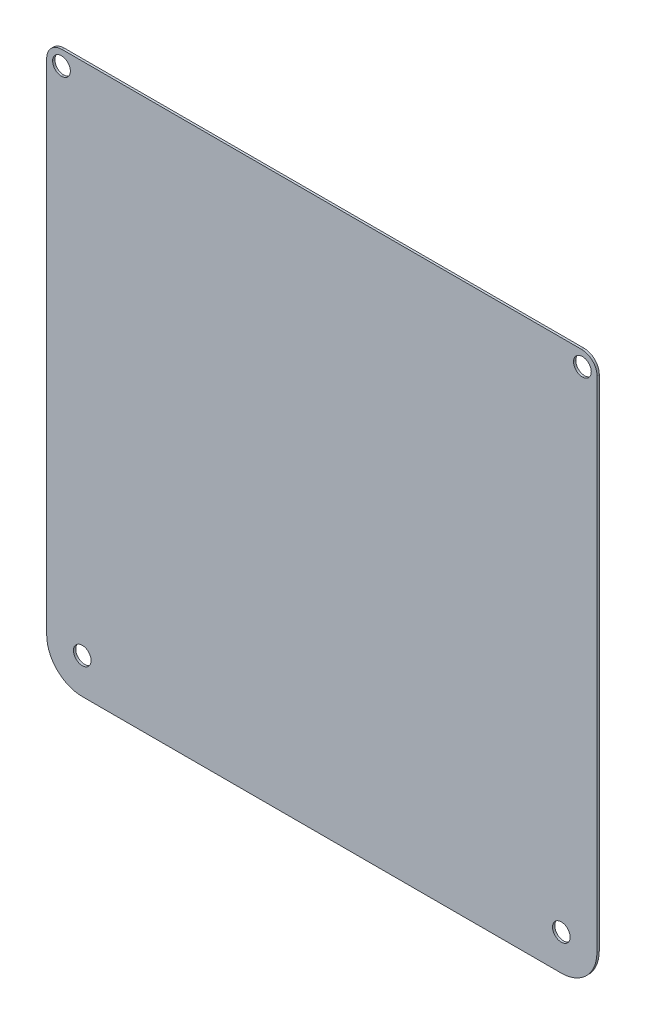
ISO-10303-21;
HEADER;
FILE_DESCRIPTION(('STEP AP214'),'2;1');
FILE_NAME('part.step','',(''),(''),'','','');
FILE_SCHEMA(('AUTOMOTIVE_DESIGN { 1 0 10303 214 1 1 1 1 }'));
ENDSEC;
DATA;
#1=APPLICATION_CONTEXT('core data for automotive mechanical design processes');
#2=APPLICATION_PROTOCOL_DEFINITION('international standard','automotive_design',2000,#1);
#3=PRODUCT_CONTEXT('',#1,'mechanical');
#4=PRODUCT('Part','Part','',(#3));
#5=PRODUCT_RELATED_PRODUCT_CATEGORY('part','',(#4));
#6=PRODUCT_DEFINITION_FORMATION('','',#4);
#7=PRODUCT_DEFINITION_CONTEXT('part definition',#1,'design');
#8=PRODUCT_DEFINITION('design','',#6,#7);
#9=PRODUCT_DEFINITION_SHAPE('','',#8);
#10=(LENGTH_UNIT() NAMED_UNIT(*) SI_UNIT(.MILLI.,.METRE.));
#11=(NAMED_UNIT(*) PLANE_ANGLE_UNIT() SI_UNIT($,.RADIAN.));
#12=(NAMED_UNIT(*) SI_UNIT($,.STERADIAN.) SOLID_ANGLE_UNIT());
#13=UNCERTAINTY_MEASURE_WITH_UNIT(LENGTH_MEASURE(1.E-05),#10,'distance_accuracy_value','');
#14=(GEOMETRIC_REPRESENTATION_CONTEXT(3) GLOBAL_UNCERTAINTY_ASSIGNED_CONTEXT((#13)) GLOBAL_UNIT_ASSIGNED_CONTEXT((#10,
#11,#12)) REPRESENTATION_CONTEXT('',''));
#15=CARTESIAN_POINT('',(0.,0.,0.));
#16=DIRECTION('',(0.,0.,1.));
#17=DIRECTION('',(1.,0.,0.));
#18=AXIS2_PLACEMENT_3D('',#15,#16,#17);
#19=CARTESIAN_POINT('',(2.70000508001,97.300195580391,0.));
#20=DIRECTION('',(0.,0.,-1.));
#21=DIRECTION('',(0.999941453103216,0.0108208301820623,0.));
#22=AXIS2_PLACEMENT_3D('',#19,#20,#21);
#23=CYLINDRICAL_SURFACE('',#22,1.612702565405);
#24=DIRECTION('',(0.,0.,1.));
#25=VECTOR('',#24,1.);
#26=CARTESIAN_POINT('',(4.312613226685,97.317646360986,0.));
#27=LINE('',#26,#25);
#28=CARTESIAN_POINT('',(4.312613226685,97.317646360986,0.));
#29=VERTEX_POINT('',#28);
#30=CARTESIAN_POINT('',(4.312613226685,97.317646360986,0.411480822962));
#31=VERTEX_POINT('',#30);
#32=EDGE_CURVE('E26',#29,#31,#27,.T.);
#33=ORIENTED_EDGE('',*,*,#32,.T.);
#34=CARTESIAN_POINT('',(2.70000508001,97.300195580391,0.411480822962));
#35=DIRECTION('',(0.,0.,1.));
#36=DIRECTION('',(0.999941453103216,0.0108208301820623,0.));
#37=AXIS2_PLACEMENT_3D('',#34,#35,#36);
#38=CIRCLE('',#37,1.612702565405);
#39=CARTESIAN_POINT('',(2.70000508001,98.912898145796,0.411480822962));
#40=VERTEX_POINT('',#39);
#41=EDGE_CURVE('E268',#31,#40,#38,.T.);
#42=ORIENTED_EDGE('',*,*,#41,.T.);
#43=DIRECTION('',(0.,0.,1.));
#44=VECTOR('',#43,1.);
#45=CARTESIAN_POINT('',(2.70000508001,98.912898145796,0.));
#46=LINE('',#45,#44);
#47=CARTESIAN_POINT('',(2.70000508001,98.912898145796,0.));
#48=VERTEX_POINT('',#47);
#49=EDGE_CURVE('E11',#48,#40,#46,.T.);
#50=ORIENTED_EDGE('',*,*,#49,.F.);
#51=CARTESIAN_POINT('',(2.70000508001,97.300195580391,0.));
#52=DIRECTION('',(0.,0.,1.));
#53=DIRECTION('',(0.999941453103216,0.0108208301820623,0.));
#54=AXIS2_PLACEMENT_3D('',#51,#52,#53);
#55=CIRCLE('',#54,1.612702565405);
#56=EDGE_CURVE('E343',#29,#48,#55,.T.);
#57=ORIENTED_EDGE('',*,*,#56,.F.);
#58=EDGE_LOOP('',(#33,#42,#50,#57));
#59=FACE_BOUND('',#58,.T.);
#60=ADVANCED_FACE('F16',(#59),#23,.F.);
#61=CARTESIAN_POINT('',(2.70000508001,97.300195580391,0.));
#62=DIRECTION('',(0.,0.,-1.));
#63=DIRECTION('',(0.,1.,0.));
#64=AXIS2_PLACEMENT_3D('',#61,#62,#63);
#65=CYLINDRICAL_SURFACE('',#64,1.612702565405);
#66=ORIENTED_EDGE('',*,*,#49,.T.);
#67=CARTESIAN_POINT('',(2.70000508001,97.300195580391,0.411480822962));
#68=DIRECTION('',(0.,0.,1.));
#69=DIRECTION('',(0.,1.,0.));
#70=AXIS2_PLACEMENT_3D('',#67,#68,#69);
#71=CIRCLE('',#70,1.612702565405);
#72=CARTESIAN_POINT('',(1.087302514605,97.300195580391,0.411480822962));
#73=VERTEX_POINT('',#72);
#74=EDGE_CURVE('E367',#40,#73,#71,.T.);
#75=ORIENTED_EDGE('',*,*,#74,.T.);
#76=DIRECTION('',(0.,0.,1.));
#77=VECTOR('',#76,1.);
#78=CARTESIAN_POINT('',(1.087302514605,97.300195580391,0.));
#79=LINE('',#78,#77);
#80=CARTESIAN_POINT('',(1.087302514605,97.300195580391,0.));
#81=VERTEX_POINT('',#80);
#82=EDGE_CURVE('E292',#81,#73,#79,.T.);
#83=ORIENTED_EDGE('',*,*,#82,.F.);
#84=CARTESIAN_POINT('',(2.70000508001,97.300195580391,0.));
#85=DIRECTION('',(0.,0.,1.));
#86=DIRECTION('',(0.,1.,0.));
#87=AXIS2_PLACEMENT_3D('',#84,#85,#86);
#88=CIRCLE('',#87,1.612702565405);
#89=EDGE_CURVE('E347',#48,#81,#88,.T.);
#90=ORIENTED_EDGE('',*,*,#89,.F.);
#91=EDGE_LOOP('',(#66,#75,#83,#90));
#92=FACE_BOUND('',#91,.T.);
#93=ADVANCED_FACE('F601',(#92),#65,.F.);
#94=CARTESIAN_POINT('',(4.312707645415,97.300195580401,0.));
#95=DIRECTION('',(-0.99998536316867,-0.00541049428641121,0.));
#96=DIRECTION('',(-0.00541049428641121,0.99998536316867,0.));
#97=AXIS2_PLACEMENT_3D('',#94,#95,#96);
#98=PLANE('',#97);
#99=DIRECTION('',(0.,0.,1.));
#100=VECTOR('',#99,1.);
#101=CARTESIAN_POINT('',(4.312707645415,97.300195581343,0.));
#102=LINE('',#101,#100);
#103=CARTESIAN_POINT('',(4.312707645415,97.300195581343,0.));
#104=VERTEX_POINT('',#103);
#105=CARTESIAN_POINT('',(4.312707645415,97.300195581343,0.411480822962));
#106=VERTEX_POINT('',#105);
#107=EDGE_CURVE('E40',#104,#106,#102,.T.);
#108=ORIENTED_EDGE('',*,*,#107,.T.);
#109=DIRECTION('',(-0.00541049428641121,0.99998536316867,0.));
#110=VECTOR('',#109,1.);
#111=CARTESIAN_POINT('',(4.312707645415,97.300195580401,0.411480822962));
#112=LINE('',#111,#110);
#113=EDGE_CURVE('E264',#106,#31,#112,.T.);
#114=ORIENTED_EDGE('',*,*,#113,.T.);
#115=ORIENTED_EDGE('',*,*,#32,.F.);
#116=DIRECTION('',(-0.00541049428641121,0.99998536316867,0.));
#117=VECTOR('',#116,1.);
#118=CARTESIAN_POINT('',(4.312707645415,97.300195580401,0.));
#119=LINE('',#118,#117);
#120=EDGE_CURVE('E19',#104,#29,#119,.T.);
#121=ORIENTED_EDGE('',*,*,#120,.F.);
#122=EDGE_LOOP('',(#108,#114,#115,#121));
#123=FACE_BOUND('',#122,.T.);
#124=ADVANCED_FACE('F524',(#123),#98,.T.);
#125=CARTESIAN_POINT('',(2.70000508001,97.300195580391,0.));
#126=DIRECTION('',(0.,0.,-1.));
#127=DIRECTION('',(-1.,0.,0.));
#128=AXIS2_PLACEMENT_3D('',#125,#126,#127);
#129=CYLINDRICAL_SURFACE('',#128,1.612702565405);
#130=ORIENTED_EDGE('',*,*,#82,.T.);
#131=CARTESIAN_POINT('',(2.70000508001,97.300195580391,0.411480822962));
#132=DIRECTION('',(0.,0.,1.));
#133=DIRECTION('',(-1.,0.,0.));
#134=AXIS2_PLACEMENT_3D('',#131,#132,#133);
#135=CIRCLE('',#134,1.612702565405);
#136=CARTESIAN_POINT('',(2.70000508001,95.687493014986,0.411480822962));
#137=VERTEX_POINT('',#136);
#138=EDGE_CURVE('E374',#73,#137,#135,.T.);
#139=ORIENTED_EDGE('',*,*,#138,.T.);
#140=DIRECTION('',(0.,0.,1.));
#141=VECTOR('',#140,1.);
#142=CARTESIAN_POINT('',(2.70000508001,95.687493014986,0.));
#143=LINE('',#142,#141);
#144=CARTESIAN_POINT('',(2.70000508001,95.687493014986,0.));
#145=VERTEX_POINT('',#144);
#146=EDGE_CURVE('E269',#145,#137,#143,.T.);
#147=ORIENTED_EDGE('',*,*,#146,.F.);
#148=CARTESIAN_POINT('',(2.70000508001,97.300195580391,0.));
#149=DIRECTION('',(0.,0.,1.));
#150=DIRECTION('',(-1.,0.,0.));
#151=AXIS2_PLACEMENT_3D('',#148,#149,#150);
#152=CIRCLE('',#151,1.612702565405);
#153=EDGE_CURVE('E276',#81,#145,#152,.T.);
#154=ORIENTED_EDGE('',*,*,#153,.F.);
#155=EDGE_LOOP('',(#130,#139,#147,#154));
#156=FACE_BOUND('',#155,.T.);
#157=ADVANCED_FACE('F572',(#156),#129,.F.);
#158=CARTESIAN_POINT('',(2.70000508001,97.300195580391,0.));
#159=DIRECTION('',(0.,0.,-1.));
#160=DIRECTION('',(0.,-1.,0.));
#161=AXIS2_PLACEMENT_3D('',#158,#159,#160);
#162=CYLINDRICAL_SURFACE('',#161,1.612702565405);
#163=ORIENTED_EDGE('',*,*,#146,.T.);
#164=CARTESIAN_POINT('',(2.70000508001,97.300195580391,0.411480822962));
#165=DIRECTION('',(0.,0.,1.));
#166=DIRECTION('',(0.,-1.,0.));
#167=AXIS2_PLACEMENT_3D('',#164,#165,#166);
#168=CIRCLE('',#167,1.612702565405);
#169=EDGE_CURVE('E267',#137,#106,#168,.T.);
#170=ORIENTED_EDGE('',*,*,#169,.T.);
#171=ORIENTED_EDGE('',*,*,#107,.F.);
#172=CARTESIAN_POINT('',(2.70000508001,97.300195580391,0.));
#173=DIRECTION('',(0.,0.,1.));
#174=DIRECTION('',(0.,-1.,0.));
#175=AXIS2_PLACEMENT_3D('',#172,#173,#174);
#176=CIRCLE('',#175,1.612702565405);
#177=EDGE_CURVE('E428',#145,#104,#176,.T.);
#178=ORIENTED_EDGE('',*,*,#177,.F.);
#179=EDGE_LOOP('',(#163,#170,#171,#178));
#180=FACE_BOUND('',#179,.T.);
#181=ADVANCED_FACE('F521',(#180),#162,.F.);
#182=CARTESIAN_POINT('',(97.300195580391,97.300195580391,0.));
#183=DIRECTION('',(0.,0.,-1.));
#184=DIRECTION('',(0.999941453103216,0.0108208301820623,0.));
#185=AXIS2_PLACEMENT_3D('',#182,#183,#184);
#186=CYLINDRICAL_SURFACE('',#185,1.612702565405);
#187=DIRECTION('',(0.,0.,1.));
#188=VECTOR('',#187,1.);
#189=CARTESIAN_POINT('',(98.912803727066,97.317646360986,0.));
#190=LINE('',#189,#188);
#191=CARTESIAN_POINT('',(98.912803727066,97.317646360986,0.));
#192=VERTEX_POINT('',#191);
#193=CARTESIAN_POINT('',(98.912803727066,97.317646360986,0.411480822962));
#194=VERTEX_POINT('',#193);
#195=EDGE_CURVE('E219',#192,#194,#190,.T.);
#196=ORIENTED_EDGE('',*,*,#195,.T.);
#197=CARTESIAN_POINT('',(97.300195580391,97.300195580391,0.411480822962));
#198=DIRECTION('',(0.,0.,1.));
#199=DIRECTION('',(0.999941453103216,0.0108208301820623,0.));
#200=AXIS2_PLACEMENT_3D('',#197,#198,#199);
#201=CIRCLE('',#200,1.612702565405);
#202=CARTESIAN_POINT('',(97.300195580391,98.912898145796,0.411480822962));
#203=VERTEX_POINT('',#202);
#204=EDGE_CURVE('E223',#194,#203,#201,.T.);
#205=ORIENTED_EDGE('',*,*,#204,.T.);
#206=DIRECTION('',(0.,0.,1.));
#207=VECTOR('',#206,1.);
#208=CARTESIAN_POINT('',(97.300195580391,98.912898145796,0.));
#209=LINE('',#208,#207);
#210=CARTESIAN_POINT('',(97.300195580391,98.912898145796,0.));
#211=VERTEX_POINT('',#210);
#212=EDGE_CURVE('E212',#211,#203,#209,.T.);
#213=ORIENTED_EDGE('',*,*,#212,.F.);
#214=CARTESIAN_POINT('',(97.300195580391,97.300195580391,0.));
#215=DIRECTION('',(0.,0.,1.));
#216=DIRECTION('',(0.999941453103216,0.0108208301820623,0.));
#217=AXIS2_PLACEMENT_3D('',#214,#215,#216);
#218=CIRCLE('',#217,1.612702565405);
#219=EDGE_CURVE('E226',#192,#211,#218,.T.);
#220=ORIENTED_EDGE('',*,*,#219,.F.);
#221=EDGE_LOOP('',(#196,#205,#213,#220));
#222=FACE_BOUND('',#221,.T.);
#223=ADVANCED_FACE('F221',(#222),#186,.F.);
#224=CARTESIAN_POINT('',(97.300195580391,97.300195580391,0.));
#225=DIRECTION('',(0.,0.,-1.));
#226=DIRECTION('',(0.,1.,0.));
#227=AXIS2_PLACEMENT_3D('',#224,#225,#226);
#228=CYLINDRICAL_SURFACE('',#227,1.612702565405);
#229=ORIENTED_EDGE('',*,*,#212,.T.);
#230=CARTESIAN_POINT('',(97.300195580391,97.300195580391,0.411480822962));
#231=DIRECTION('',(0.,0.,1.));
#232=DIRECTION('',(0.,1.,0.));
#233=AXIS2_PLACEMENT_3D('',#230,#231,#232);
#234=CIRCLE('',#233,1.612702565405);
#235=CARTESIAN_POINT('',(95.687493014986,97.300195580391,0.411480822962));
#236=VERTEX_POINT('',#235);
#237=EDGE_CURVE('E246',#203,#236,#234,.T.);
#238=ORIENTED_EDGE('',*,*,#237,.T.);
#239=DIRECTION('',(0.,0.,1.));
#240=VECTOR('',#239,1.);
#241=CARTESIAN_POINT('',(95.687493014986,97.300195580391,0.));
#242=LINE('',#241,#240);
#243=CARTESIAN_POINT('',(95.687493014986,97.300195580391,0.));
#244=VERTEX_POINT('',#243);
#245=EDGE_CURVE('E231',#244,#236,#242,.T.);
#246=ORIENTED_EDGE('',*,*,#245,.F.);
#247=CARTESIAN_POINT('',(97.300195580391,97.300195580391,0.));
#248=DIRECTION('',(0.,0.,1.));
#249=DIRECTION('',(0.,1.,0.));
#250=AXIS2_PLACEMENT_3D('',#247,#248,#249);
#251=CIRCLE('',#250,1.612702565405);
#252=EDGE_CURVE('E429',#211,#244,#251,.T.);
#253=ORIENTED_EDGE('',*,*,#252,.F.);
#254=EDGE_LOOP('',(#229,#238,#246,#253));
#255=FACE_BOUND('',#254,.T.);
#256=ADVANCED_FACE('F591',(#255),#228,.F.);
#257=CARTESIAN_POINT('',(98.912898145796,97.300195580401,0.));
#258=DIRECTION('',(-0.99998536316867,-0.00541049428641121,0.));
#259=DIRECTION('',(-0.00541049428641121,0.99998536316867,0.));
#260=AXIS2_PLACEMENT_3D('',#257,#258,#259);
#261=PLANE('',#260);
#262=DIRECTION('',(0.,0.,1.));
#263=VECTOR('',#262,1.);
#264=CARTESIAN_POINT('',(98.912898145796,97.300195581343,0.));
#265=LINE('',#264,#263);
#266=CARTESIAN_POINT('',(98.912898145796,97.300195581343,0.));
#267=VERTEX_POINT('',#266);
#268=CARTESIAN_POINT('',(98.912898145796,97.300195581343,0.411480822962));
#269=VERTEX_POINT('',#268);
#270=EDGE_CURVE('E236',#267,#269,#265,.T.);
#271=ORIENTED_EDGE('',*,*,#270,.T.);
#272=DIRECTION('',(-0.00541049428641121,0.99998536316867,0.));
#273=VECTOR('',#272,1.);
#274=CARTESIAN_POINT('',(98.912898145796,97.300195580401,0.411480822962));
#275=LINE('',#274,#273);
#276=EDGE_CURVE('E234',#269,#194,#275,.T.);
#277=ORIENTED_EDGE('',*,*,#276,.T.);
#278=ORIENTED_EDGE('',*,*,#195,.F.);
#279=DIRECTION('',(-0.00541049428641121,0.99998536316867,0.));
#280=VECTOR('',#279,1.);
#281=CARTESIAN_POINT('',(98.912898145796,97.300195580401,0.));
#282=LINE('',#281,#280);
#283=EDGE_CURVE('E307',#267,#192,#282,.T.);
#284=ORIENTED_EDGE('',*,*,#283,.F.);
#285=EDGE_LOOP('',(#271,#277,#278,#284));
#286=FACE_BOUND('',#285,.T.);
#287=ADVANCED_FACE('F235',(#286),#261,.T.);
#288=CARTESIAN_POINT('',(97.300195580391,97.300195580391,0.));
#289=DIRECTION('',(0.,0.,-1.));
#290=DIRECTION('',(-1.,0.,0.));
#291=AXIS2_PLACEMENT_3D('',#288,#289,#290);
#292=CYLINDRICAL_SURFACE('',#291,1.612702565405);
#293=ORIENTED_EDGE('',*,*,#245,.T.);
#294=CARTESIAN_POINT('',(97.300195580391,97.300195580391,0.411480822962));
#295=DIRECTION('',(0.,0.,1.));
#296=DIRECTION('',(-1.,0.,0.));
#297=AXIS2_PLACEMENT_3D('',#294,#295,#296);
#298=CIRCLE('',#297,1.612702565405);
#299=CARTESIAN_POINT('',(97.300195580391,95.687493014986,0.411480822962));
#300=VERTEX_POINT('',#299);
#301=EDGE_CURVE('E253',#236,#300,#298,.T.);
#302=ORIENTED_EDGE('',*,*,#301,.T.);
#303=DIRECTION('',(0.,0.,1.));
#304=VECTOR('',#303,1.);
#305=CARTESIAN_POINT('',(97.300195580391,95.687493014986,0.));
#306=LINE('',#305,#304);
#307=CARTESIAN_POINT('',(97.300195580391,95.687493014986,0.));
#308=VERTEX_POINT('',#307);
#309=EDGE_CURVE('E370',#308,#300,#306,.T.);
#310=ORIENTED_EDGE('',*,*,#309,.F.);
#311=CARTESIAN_POINT('',(97.300195580391,97.300195580391,0.));
#312=DIRECTION('',(0.,0.,1.));
#313=DIRECTION('',(-1.,0.,0.));
#314=AXIS2_PLACEMENT_3D('',#311,#312,#313);
#315=CIRCLE('',#314,1.612702565405);
#316=EDGE_CURVE('E424',#244,#308,#315,.T.);
#317=ORIENTED_EDGE('',*,*,#316,.F.);
#318=EDGE_LOOP('',(#293,#302,#310,#317));
#319=FACE_BOUND('',#318,.T.);
#320=ADVANCED_FACE('F544',(#319),#292,.F.);
#321=CARTESIAN_POINT('',(97.300195580391,97.300195580391,0.));
#322=DIRECTION('',(0.,0.,-1.));
#323=DIRECTION('',(0.,-1.,0.));
#324=AXIS2_PLACEMENT_3D('',#321,#322,#323);
#325=CYLINDRICAL_SURFACE('',#324,1.612702565405);
#326=ORIENTED_EDGE('',*,*,#309,.T.);
#327=CARTESIAN_POINT('',(97.300195580391,97.300195580391,0.411480822962));
#328=DIRECTION('',(0.,0.,1.));
#329=DIRECTION('',(0.,-1.,0.));
#330=AXIS2_PLACEMENT_3D('',#327,#328,#329);
#331=CIRCLE('',#330,1.612702565405);
#332=EDGE_CURVE('E241',#300,#269,#331,.T.);
#333=ORIENTED_EDGE('',*,*,#332,.T.);
#334=ORIENTED_EDGE('',*,*,#270,.F.);
#335=CARTESIAN_POINT('',(97.300195580391,97.300195580391,0.));
#336=DIRECTION('',(0.,0.,1.));
#337=DIRECTION('',(0.,-1.,0.));
#338=AXIS2_PLACEMENT_3D('',#335,#336,#337);
#339=CIRCLE('',#338,1.612702565405);
#340=EDGE_CURVE('E289',#308,#267,#339,.T.);
#341=ORIENTED_EDGE('',*,*,#340,.F.);
#342=EDGE_LOOP('',(#326,#333,#334,#341));
#343=FACE_BOUND('',#342,.T.);
#344=ADVANCED_FACE('F460',(#343),#325,.F.);
#345=CARTESIAN_POINT('',(6.477012954026,6.477012954026,0.));
#346=DIRECTION('',(0.,0.,1.));
#347=DIRECTION('',(1.,0.,0.));
#348=AXIS2_PLACEMENT_3D('',#345,#346,#347);
#349=CYLINDRICAL_SURFACE('',#348,1.600003810008);
#350=DIRECTION('',(0.,0.,1.));
#351=VECTOR('',#350,1.);
#352=CARTESIAN_POINT('',(8.077016764034,6.477012954026,0.));
#353=LINE('',#352,#351);
#354=CARTESIAN_POINT('',(8.077016764034,6.477012954026,0.));
#355=VERTEX_POINT('',#354);
#356=CARTESIAN_POINT('',(8.077016764034,6.477012954026,0.411480822962));
#357=VERTEX_POINT('',#356);
#358=EDGE_CURVE('E152',#355,#357,#353,.T.);
#359=ORIENTED_EDGE('',*,*,#358,.F.);
#360=CARTESIAN_POINT('',(6.477012954026,6.477012954026,0.));
#361=DIRECTION('',(0.,0.,1.));
#362=DIRECTION('',(1.,0.,0.));
#363=AXIS2_PLACEMENT_3D('',#360,#361,#362);
#364=CIRCLE('',#363,1.600003810008);
#365=EDGE_CURVE('E262',#355,#355,#364,.T.);
#366=ORIENTED_EDGE('',*,*,#365,.F.);
#367=ORIENTED_EDGE('',*,*,#358,.T.);
#368=CARTESIAN_POINT('',(6.477012954026,6.477012954026,0.411480822962));
#369=DIRECTION('',(0.,0.,1.));
#370=DIRECTION('',(1.,0.,0.));
#371=AXIS2_PLACEMENT_3D('',#368,#369,#370);
#372=CIRCLE('',#371,1.600003810008);
#373=EDGE_CURVE('E323',#357,#357,#372,.T.);
#374=ORIENTED_EDGE('',*,*,#373,.T.);
#375=EDGE_LOOP('',(#359,#366,#367,#374));
#376=FACE_BOUND('',#375,.T.);
#377=ADVANCED_FACE('F552',(#376),#349,.F.);
#378=CARTESIAN_POINT('',(93.472186944374,6.477012954026,0.));
#379=DIRECTION('',(0.,0.,1.));
#380=DIRECTION('',(1.,0.,0.));
#381=AXIS2_PLACEMENT_3D('',#378,#379,#380);
#382=CYLINDRICAL_SURFACE('',#381,1.600003810008);
#383=DIRECTION('',(0.,0.,1.));
#384=VECTOR('',#383,1.);
#385=CARTESIAN_POINT('',(95.072190754382,6.477012954026,0.));
#386=LINE('',#385,#384);
#387=CARTESIAN_POINT('',(95.072190754382,6.477012954026,0.));
#388=VERTEX_POINT('',#387);
#389=CARTESIAN_POINT('',(95.072190754382,6.477012954026,0.411480822962));
#390=VERTEX_POINT('',#389);
#391=EDGE_CURVE('E164',#388,#390,#386,.T.);
#392=ORIENTED_EDGE('',*,*,#391,.F.);
#393=CARTESIAN_POINT('',(93.472186944374,6.477012954026,0.));
#394=DIRECTION('',(0.,0.,1.));
#395=DIRECTION('',(1.,0.,0.));
#396=AXIS2_PLACEMENT_3D('',#393,#394,#395);
#397=CIRCLE('',#396,1.600003810008);
#398=EDGE_CURVE('E259',#388,#388,#397,.T.);
#399=ORIENTED_EDGE('',*,*,#398,.F.);
#400=ORIENTED_EDGE('',*,*,#391,.T.);
#401=CARTESIAN_POINT('',(93.472186944374,6.477012954026,0.411480822962));
#402=DIRECTION('',(0.,0.,1.));
#403=DIRECTION('',(1.,0.,0.));
#404=AXIS2_PLACEMENT_3D('',#401,#402,#403);
#405=CIRCLE('',#404,1.600003810008);
#406=EDGE_CURVE('E312',#390,#390,#405,.T.);
#407=ORIENTED_EDGE('',*,*,#406,.T.);
#408=EDGE_LOOP('',(#392,#399,#400,#407));
#409=FACE_BOUND('',#408,.T.);
#410=ADVANCED_FACE('F557',(#409),#382,.F.);
#411=CARTESIAN_POINT('',(99.961899900713,97.180952719278,0.));
#412=DIRECTION('',(1.,2.824996688762E-08,0.));
#413=DIRECTION('',(0.,0.,-1.));
#414=AXIS2_PLACEMENT_3D('',#411,#412,#413);
#415=PLANE('',#414);
#416=DIRECTION('',(0.,0.,1.));
#417=VECTOR('',#416,1.);
#418=CARTESIAN_POINT('',(99.961899900713,97.180952719278,0.));
#419=LINE('',#418,#417);
#420=CARTESIAN_POINT('',(99.961899900713,97.180952719278,0.));
#421=VERTEX_POINT('',#420);
#422=CARTESIAN_POINT('',(99.961899900713,97.180952719278,0.411480822962));
#423=VERTEX_POINT('',#422);
#424=EDGE_CURVE('E327',#421,#423,#419,.T.);
#425=ORIENTED_EDGE('',*,*,#424,.T.);
#426=DIRECTION('',(2.824996688762E-08,-1.,0.));
#427=VECTOR('',#426,1.);
#428=CARTESIAN_POINT('',(99.961899900713,97.180952719278,0.411480822962));
#429=LINE('',#428,#427);
#430=CARTESIAN_POINT('',(99.961902462738,6.489712979426,0.411480822962));
#431=VERTEX_POINT('',#430);
#432=EDGE_CURVE('E333',#423,#431,#429,.T.);
#433=ORIENTED_EDGE('',*,*,#432,.T.);
#434=DIRECTION('',(0.,0.,1.));
#435=VECTOR('',#434,1.);
#436=CARTESIAN_POINT('',(99.961902462738,6.489712979426,0.));
#437=LINE('',#436,#435);
#438=CARTESIAN_POINT('',(99.961902462738,6.489712979426,0.));
#439=VERTEX_POINT('',#438);
#440=EDGE_CURVE('E324',#439,#431,#437,.T.);
#441=ORIENTED_EDGE('',*,*,#440,.F.);
#442=DIRECTION('',(2.824996688762E-08,-1.,0.));
#443=VECTOR('',#442,1.);
#444=CARTESIAN_POINT('',(99.961899900713,97.180952719278,0.));
#445=LINE('',#444,#443);
#446=EDGE_CURVE('E338',#421,#439,#445,.T.);
#447=ORIENTED_EDGE('',*,*,#446,.F.);
#448=EDGE_LOOP('',(#425,#433,#441,#447));
#449=FACE_BOUND('',#448,.T.);
#450=ADVANCED_FACE('F536',(#449),#415,.T.);
#451=CARTESIAN_POINT('',(99.961902462738,6.489712979426,0.));
#452=DIRECTION('',(0.,-1.,0.));
#453=DIRECTION('',(0.,0.,-1.));
#454=AXIS2_PLACEMENT_3D('',#451,#452,#453);
#455=PLANE('',#454);
#456=ORIENTED_EDGE('',*,*,#440,.T.);
#457=DIRECTION('',(-1.,0.,0.));
#458=VECTOR('',#457,1.);
#459=CARTESIAN_POINT('',(99.961902462738,6.489712979426,0.411480822962));
#460=LINE('',#459,#458);
#461=CARTESIAN_POINT('',(99.9491998984,6.489712979426,0.411480822962));
#462=VERTEX_POINT('',#461);
#463=EDGE_CURVE('E332',#431,#462,#460,.T.);
#464=ORIENTED_EDGE('',*,*,#463,.T.);
#465=DIRECTION('',(0.,0.,1.));
#466=VECTOR('',#465,1.);
#467=CARTESIAN_POINT('',(99.9491998984,6.489712979426,0.));
#468=LINE('',#467,#466);
#469=CARTESIAN_POINT('',(99.9491998984,6.489712979426,0.));
#470=VERTEX_POINT('',#469);
#471=EDGE_CURVE('E355',#470,#462,#468,.T.);
#472=ORIENTED_EDGE('',*,*,#471,.F.);
#473=DIRECTION('',(-1.,0.,0.));
#474=VECTOR('',#473,1.);
#475=CARTESIAN_POINT('',(99.961902462738,6.489712979426,0.));
#476=LINE('',#475,#474);
#477=EDGE_CURVE('E303',#439,#470,#476,.T.);
#478=ORIENTED_EDGE('',*,*,#477,.F.);
#479=EDGE_LOOP('',(#456,#464,#472,#478));
#480=FACE_BOUND('',#479,.T.);
#481=ADVANCED_FACE('F530',(#480),#455,.T.);
#482=CARTESIAN_POINT('',(97.180594361189,97.180594361189,0.));
#483=DIRECTION('',(0.,0.,-1.));
#484=DIRECTION('',(3.686394892713E-10,1.,0.));
#485=AXIS2_PLACEMENT_3D('',#482,#483,#484);
#486=CYLINDRICAL_SURFACE('',#485,2.781305562611);
#487=DIRECTION('',(0.,0.,1.));
#488=VECTOR('',#487,1.);
#489=CARTESIAN_POINT('',(97.180594362214,99.9618999238,0.));
#490=LINE('',#489,#488);
#491=CARTESIAN_POINT('',(97.180594362214,99.9618999238,0.));
#492=VERTEX_POINT('',#491);
#493=CARTESIAN_POINT('',(97.180594362214,99.9618999238,0.411480822962));
#494=VERTEX_POINT('',#493);
#495=EDGE_CURVE('E296',#492,#494,#490,.T.);
#496=ORIENTED_EDGE('',*,*,#495,.T.);
#497=CARTESIAN_POINT('',(97.180594361189,97.180594361189,0.411480822962));
#498=DIRECTION('',(0.,0.,-1.));
#499=DIRECTION('',(3.686394892713E-10,1.,0.));
#500=AXIS2_PLACEMENT_3D('',#497,#498,#499);
#501=CIRCLE('',#500,2.781305562611);
#502=EDGE_CURVE('E337',#494,#423,#501,.T.);
#503=ORIENTED_EDGE('',*,*,#502,.T.);
#504=ORIENTED_EDGE('',*,*,#424,.F.);
#505=CARTESIAN_POINT('',(97.180594361189,97.180594361189,0.));
#506=DIRECTION('',(0.,0.,-1.));
#507=DIRECTION('',(3.686394892713E-10,1.,0.));
#508=AXIS2_PLACEMENT_3D('',#505,#506,#507);
#509=CIRCLE('',#508,2.781305562611);
#510=EDGE_CURVE('E342',#492,#421,#509,.T.);
#511=ORIENTED_EDGE('',*,*,#510,.F.);
#512=EDGE_LOOP('',(#496,#503,#504,#511));
#513=FACE_BOUND('',#512,.T.);
#514=ADVANCED_FACE('F535',(#513),#486,.T.);
#515=CARTESIAN_POINT('',(99.949199900278,6.477012954026,0.));
#516=DIRECTION('',(0.,0.,-1.));
#517=DIRECTION('',(-1.47905619683098E-07,0.999999999999989,0.));
#518=AXIS2_PLACEMENT_3D('',#515,#516,#517);
#519=CYLINDRICAL_SURFACE('',#518,0.01270002540005);
#520=ORIENTED_EDGE('',*,*,#471,.T.);
#521=CARTESIAN_POINT('',(99.949199900278,6.477012954026,0.411480822962));
#522=DIRECTION('',(0.,0.,1.));
#523=DIRECTION('',(-1.47905619683098E-07,0.999999999999989,0.));
#524=AXIS2_PLACEMENT_3D('',#521,#522,#523);
#525=CIRCLE('',#524,0.01270002540005);
#526=CARTESIAN_POINT('',(99.936499874878,6.477012954026,0.411480822962));
#527=VERTEX_POINT('',#526);
#528=EDGE_CURVE('E328',#462,#527,#525,.T.);
#529=ORIENTED_EDGE('',*,*,#528,.T.);
#530=DIRECTION('',(0.,0.,1.));
#531=VECTOR('',#530,1.);
#532=CARTESIAN_POINT('',(99.936499874878,6.477012954026,0.));
#533=LINE('',#532,#531);
#534=CARTESIAN_POINT('',(99.936499874878,6.477012954026,0.));
#535=VERTEX_POINT('',#534);
#536=EDGE_CURVE('E293',#535,#527,#533,.T.);
#537=ORIENTED_EDGE('',*,*,#536,.F.);
#538=CARTESIAN_POINT('',(99.949199900278,6.477012954026,0.));
#539=DIRECTION('',(0.,0.,1.));
#540=DIRECTION('',(-1.47905619683098E-07,0.999999999999989,0.));
#541=AXIS2_PLACEMENT_3D('',#538,#539,#540);
#542=CIRCLE('',#541,0.01270002540005);
#543=EDGE_CURVE('E298',#470,#535,#542,.T.);
#544=ORIENTED_EDGE('',*,*,#543,.F.);
#545=EDGE_LOOP('',(#520,#529,#537,#544));
#546=FACE_BOUND('',#545,.T.);
#547=ADVANCED_FACE('F610',(#546),#519,.F.);
#548=CARTESIAN_POINT('',(2.793566712444,99.961899889174,0.));
#549=DIRECTION('',(-3.668527449115E-10,1.,0.));
#550=DIRECTION('',(0.,0.,1.));
#551=AXIS2_PLACEMENT_3D('',#548,#549,#550);
#552=PLANE('',#551);
#553=DIRECTION('',(0.,0.,1.));
#554=VECTOR('',#553,1.);
#555=CARTESIAN_POINT('',(2.793566712444,99.961899889174,0.));
#556=LINE('',#555,#554);
#557=CARTESIAN_POINT('',(2.793566712444,99.961899889174,0.));
#558=VERTEX_POINT('',#557);
#559=CARTESIAN_POINT('',(2.793566712444,99.961899889174,0.411480822962));
#560=VERTEX_POINT('',#559);
#561=EDGE_CURVE('E297',#558,#560,#556,.T.);
#562=ORIENTED_EDGE('',*,*,#561,.T.);
#563=DIRECTION('',(1.,3.668527449115E-10,0.));
#564=VECTOR('',#563,1.);
#565=CARTESIAN_POINT('',(2.793566712444,99.961899889174,0.411480822962));
#566=LINE('',#565,#564);
#567=EDGE_CURVE('E313',#560,#494,#566,.T.);
#568=ORIENTED_EDGE('',*,*,#567,.T.);
#569=ORIENTED_EDGE('',*,*,#495,.F.);
#570=DIRECTION('',(1.,3.668527449115E-10,0.));
#571=VECTOR('',#570,1.);
#572=CARTESIAN_POINT('',(2.793566712444,99.961899889174,0.));
#573=LINE('',#572,#571);
#574=EDGE_CURVE('E378',#558,#492,#573,.T.);
#575=ORIENTED_EDGE('',*,*,#574,.F.);
#576=EDGE_LOOP('',(#562,#568,#569,#575));
#577=FACE_BOUND('',#576,.T.);
#578=ADVANCED_FACE('F584',(#577),#552,.T.);
#579=CARTESIAN_POINT('',(93.472186946252,6.477012954026,0.));
#580=DIRECTION('',(0.,0.,-1.));
#581=DIRECTION('',(1.,0.,0.));
#582=AXIS2_PLACEMENT_3D('',#579,#580,#581);
#583=CYLINDRICAL_SURFACE('',#582,6.464312928626);
#584=ORIENTED_EDGE('',*,*,#536,.T.);
#585=CARTESIAN_POINT('',(93.472186946252,6.477012954026,0.411480822962));
#586=DIRECTION('',(0.,0.,-1.));
#587=DIRECTION('',(1.,0.,0.));
#588=AXIS2_PLACEMENT_3D('',#585,#586,#587);
#589=CIRCLE('',#588,6.464312928626);
#590=CARTESIAN_POINT('',(93.472186944374,0.01270002540005,0.411480822962));
#591=VERTEX_POINT('',#590);
#592=EDGE_CURVE('E275',#527,#591,#589,.T.);
#593=ORIENTED_EDGE('',*,*,#592,.T.);
#594=DIRECTION('',(0.,0.,1.));
#595=VECTOR('',#594,1.);
#596=CARTESIAN_POINT('',(93.472186944374,0.01270002540005,0.));
#597=LINE('',#596,#595);
#598=CARTESIAN_POINT('',(93.472186944374,0.01270002540005,0.));
#599=VERTEX_POINT('',#598);
#600=EDGE_CURVE('E279',#599,#591,#597,.T.);
#601=ORIENTED_EDGE('',*,*,#600,.F.);
#602=CARTESIAN_POINT('',(93.472186946252,6.477012954026,0.));
#603=DIRECTION('',(0.,0.,-1.));
#604=DIRECTION('',(1.,0.,0.));
#605=AXIS2_PLACEMENT_3D('',#602,#603,#604);
#606=CIRCLE('',#605,6.464312928626);
#607=EDGE_CURVE('E302',#535,#599,#606,.T.);
#608=ORIENTED_EDGE('',*,*,#607,.F.);
#609=EDGE_LOOP('',(#584,#593,#601,#608));
#610=FACE_BOUND('',#609,.T.);
#611=ADVANCED_FACE('F578',(#610),#583,.T.);
#612=CARTESIAN_POINT('',(2.794182662684,97.180412234475,0.));
#613=DIRECTION('',(0.,0.,-1.));
#614=DIRECTION('',(-0.999999997974242,-6.36515238026454E-05,0.));
#615=AXIS2_PLACEMENT_3D('',#612,#613,#614);
#616=CYLINDRICAL_SURFACE('',#615,2.781487722899);
#617=DIRECTION('',(0.,0.,1.));
#618=VECTOR('',#617,1.);
#619=CARTESIAN_POINT('',(0.01269494542007,97.180235188543,0.));
#620=LINE('',#619,#618);
#621=CARTESIAN_POINT('',(0.01269494542007,97.180235188543,0.));
#622=VERTEX_POINT('',#621);
#623=CARTESIAN_POINT('',(0.01269494542007,97.180235188543,0.411480822962));
#624=VERTEX_POINT('',#623);
#625=EDGE_CURVE('E399',#622,#624,#620,.T.);
#626=ORIENTED_EDGE('',*,*,#625,.T.);
#627=CARTESIAN_POINT('',(2.794182662684,97.180412234475,0.411480822962));
#628=DIRECTION('',(0.,0.,-1.));
#629=DIRECTION('',(-0.999999997974242,-6.36515238026454E-05,0.));
#630=AXIS2_PLACEMENT_3D('',#627,#628,#629);
#631=CIRCLE('',#630,2.781487722899);
#632=EDGE_CURVE('E308',#624,#560,#631,.T.);
#633=ORIENTED_EDGE('',*,*,#632,.T.);
#634=ORIENTED_EDGE('',*,*,#561,.F.);
#635=CARTESIAN_POINT('',(2.794182662684,97.180412234475,0.));
#636=DIRECTION('',(0.,0.,-1.));
#637=DIRECTION('',(-0.999999997974242,-6.36515238026454E-05,0.));
#638=AXIS2_PLACEMENT_3D('',#635,#636,#637);
#639=CIRCLE('',#638,2.781487722899);
#640=EDGE_CURVE('E394',#622,#558,#639,.T.);
#641=ORIENTED_EDGE('',*,*,#640,.F.);
#642=EDGE_LOOP('',(#626,#633,#634,#641));
#643=FACE_BOUND('',#642,.T.);
#644=ADVANCED_FACE('F583',(#643),#616,.T.);
#645=CARTESIAN_POINT('',(93.472186944374,0.01270002540005,0.));
#646=DIRECTION('',(8.75912408839897E-08,-1.,0.));
#647=DIRECTION('',(0.,0.,-1.));
#648=AXIS2_PLACEMENT_3D('',#645,#646,#647);
#649=PLANE('',#648);
#650=ORIENTED_EDGE('',*,*,#600,.T.);
#651=DIRECTION('',(-1.,-8.75912408839897E-08,0.));
#652=VECTOR('',#651,1.);
#653=CARTESIAN_POINT('',(93.472186944374,0.01270002540005,0.411480822962));
#654=LINE('',#653,#652);
#655=CARTESIAN_POINT('',(6.477452827375,0.01269240542334,0.411480822962));
#656=VERTEX_POINT('',#655);
#657=EDGE_CURVE('E272',#591,#656,#654,.T.);
#658=ORIENTED_EDGE('',*,*,#657,.T.);
#659=DIRECTION('',(0.,0.,1.));
#660=VECTOR('',#659,1.);
#661=CARTESIAN_POINT('',(6.477452827375,0.01269240542334,0.));
#662=LINE('',#661,#660);
#663=CARTESIAN_POINT('',(6.477452827375,0.01269240542334,0.));
#664=VERTEX_POINT('',#663);
#665=EDGE_CURVE('E318',#664,#656,#662,.T.);
#666=ORIENTED_EDGE('',*,*,#665,.F.);
#667=DIRECTION('',(-1.,-8.75912408839897E-08,0.));
#668=VECTOR('',#667,1.);
#669=CARTESIAN_POINT('',(93.472186944374,0.01270002540005,0.));
#670=LINE('',#669,#668);
#671=EDGE_CURVE('E263',#599,#664,#670,.T.);
#672=ORIENTED_EDGE('',*,*,#671,.F.);
#673=EDGE_LOOP('',(#650,#658,#666,#672));
#674=FACE_BOUND('',#673,.T.);
#675=ADVANCED_FACE('F638',(#674),#649,.T.);
#676=CARTESIAN_POINT('',(49.986351388675,50.423826775132,0.411480822962));
#677=DIRECTION('',(0.,0.,-1.));
#678=DIRECTION('',(0.,-1.,0.));
#679=AXIS2_PLACEMENT_3D('',#676,#677,#678);
#680=PLANE('',#679);
#681=ORIENTED_EDGE('',*,*,#138,.F.);
#682=ORIENTED_EDGE('',*,*,#74,.F.);
#683=ORIENTED_EDGE('',*,*,#41,.F.);
#684=ORIENTED_EDGE('',*,*,#113,.F.);
#685=ORIENTED_EDGE('',*,*,#169,.F.);
#686=EDGE_LOOP('',(#681,#682,#683,#684,#685));
#687=FACE_BOUND('',#686,.T.);
#688=ORIENTED_EDGE('',*,*,#301,.F.);
#689=ORIENTED_EDGE('',*,*,#237,.F.);
#690=ORIENTED_EDGE('',*,*,#204,.F.);
#691=ORIENTED_EDGE('',*,*,#276,.F.);
#692=ORIENTED_EDGE('',*,*,#332,.F.);
#693=EDGE_LOOP('',(#688,#689,#690,#691,#692));
#694=FACE_BOUND('',#693,.T.);
#695=ORIENTED_EDGE('',*,*,#373,.F.);
#696=EDGE_LOOP('',(#695));
#697=FACE_BOUND('',#696,.T.);
#698=ORIENTED_EDGE('',*,*,#406,.F.);
#699=EDGE_LOOP('',(#698));
#700=FACE_BOUND('',#699,.T.);
#701=DIRECTION('',(-0.999849988601175,0.017320516569413,0.));
#702=VECTOR('',#701,1.);
#703=CARTESIAN_POINT('',(6.477452827375,0.01269240542334,0.411480822962));
#704=LINE('',#703,#702);
#705=CARTESIAN_POINT('',(6.477012954026,0.01270002540005,0.411480822962));
#706=VERTEX_POINT('',#705);
#707=EDGE_CURVE('E257',#656,#706,#704,.T.);
#708=ORIENTED_EDGE('',*,*,#707,.F.);
#709=ORIENTED_EDGE('',*,*,#657,.F.);
#710=ORIENTED_EDGE('',*,*,#592,.F.);
#711=ORIENTED_EDGE('',*,*,#528,.F.);
#712=ORIENTED_EDGE('',*,*,#463,.F.);
#713=ORIENTED_EDGE('',*,*,#432,.F.);
#714=ORIENTED_EDGE('',*,*,#502,.F.);
#715=ORIENTED_EDGE('',*,*,#567,.F.);
#716=ORIENTED_EDGE('',*,*,#632,.F.);
#717=DIRECTION('',(-5.60613563956999E-08,1.,0.));
#718=VECTOR('',#717,1.);
#719=CARTESIAN_POINT('',(0.01270003037996,6.476759215294,0.411480822962));
#720=LINE('',#719,#718);
#721=CARTESIAN_POINT('',(0.01270003037996,6.476759215294,0.411480822962));
#722=VERTEX_POINT('',#721);
#723=EDGE_CURVE('E405',#722,#624,#720,.T.);
#724=ORIENTED_EDGE('',*,*,#723,.F.);
#725=CARTESIAN_POINT('',(6.477012954026,6.477012954026,0.411480822962));
#726=DIRECTION('',(0.,0.,-1.));
#727=DIRECTION('',(0.,-1.,0.));
#728=AXIS2_PLACEMENT_3D('',#725,#726,#727);
#729=CIRCLE('',#728,6.464312928626);
#730=EDGE_CURVE('E280',#706,#722,#729,.T.);
#731=ORIENTED_EDGE('',*,*,#730,.F.);
#732=EDGE_LOOP('',(#708,#709,#710,#711,#712,#713,#714,#715,#716,#724,#731));
#733=FACE_BOUND('',#732,.T.);
#734=ADVANCED_FACE('F244',(#687,#694,#697,#700,#733),#680,.F.);
#735=CARTESIAN_POINT('',(49.986351388675,50.423826775132,0.));
#736=DIRECTION('',(0.,0.,-1.));
#737=DIRECTION('',(0.,-1.,0.));
#738=AXIS2_PLACEMENT_3D('',#735,#736,#737);
#739=PLANE('',#738);
#740=ORIENTED_EDGE('',*,*,#177,.T.);
#741=ORIENTED_EDGE('',*,*,#120,.T.);
#742=ORIENTED_EDGE('',*,*,#56,.T.);
#743=ORIENTED_EDGE('',*,*,#89,.T.);
#744=ORIENTED_EDGE('',*,*,#153,.T.);
#745=EDGE_LOOP('',(#740,#741,#742,#743,#744));
#746=FACE_BOUND('',#745,.T.);
#747=ORIENTED_EDGE('',*,*,#340,.T.);
#748=ORIENTED_EDGE('',*,*,#283,.T.);
#749=ORIENTED_EDGE('',*,*,#219,.T.);
#750=ORIENTED_EDGE('',*,*,#252,.T.);
#751=ORIENTED_EDGE('',*,*,#316,.T.);
#752=EDGE_LOOP('',(#747,#748,#749,#750,#751));
#753=FACE_BOUND('',#752,.T.);
#754=ORIENTED_EDGE('',*,*,#365,.T.);
#755=EDGE_LOOP('',(#754));
#756=FACE_BOUND('',#755,.T.);
#757=ORIENTED_EDGE('',*,*,#398,.T.);
#758=EDGE_LOOP('',(#757));
#759=FACE_BOUND('',#758,.T.);
#760=CARTESIAN_POINT('',(6.477012954026,6.477012954026,0.));
#761=DIRECTION('',(0.,0.,-1.));
#762=DIRECTION('',(0.,-1.,0.));
#763=AXIS2_PLACEMENT_3D('',#760,#761,#762);
#764=CIRCLE('',#763,6.464312928626);
#765=CARTESIAN_POINT('',(6.477012954026,0.01270002540005,0.));
#766=VERTEX_POINT('',#765);
#767=CARTESIAN_POINT('',(0.01270003037996,6.476759215294,0.));
#768=VERTEX_POINT('',#767);
#769=EDGE_CURVE('E314',#766,#768,#764,.T.);
#770=ORIENTED_EDGE('',*,*,#769,.T.);
#771=DIRECTION('',(-5.60613563956999E-08,1.,0.));
#772=VECTOR('',#771,1.);
#773=CARTESIAN_POINT('',(0.01270003037996,6.476759215294,0.));
#774=LINE('',#773,#772);
#775=EDGE_CURVE('E395',#768,#622,#774,.T.);
#776=ORIENTED_EDGE('',*,*,#775,.T.);
#777=ORIENTED_EDGE('',*,*,#640,.T.);
#778=ORIENTED_EDGE('',*,*,#574,.T.);
#779=ORIENTED_EDGE('',*,*,#510,.T.);
#780=ORIENTED_EDGE('',*,*,#446,.T.);
#781=ORIENTED_EDGE('',*,*,#477,.T.);
#782=ORIENTED_EDGE('',*,*,#543,.T.);
#783=ORIENTED_EDGE('',*,*,#607,.T.);
#784=ORIENTED_EDGE('',*,*,#671,.T.);
#785=DIRECTION('',(-0.999849988601175,0.017320516569413,0.));
#786=VECTOR('',#785,1.);
#787=CARTESIAN_POINT('',(6.477452827375,0.01269240542334,0.));
#788=LINE('',#787,#786);
#789=EDGE_CURVE('E409',#664,#766,#788,.T.);
#790=ORIENTED_EDGE('',*,*,#789,.T.);
#791=EDGE_LOOP('',(#770,#776,#777,#778,#779,#780,#781,#782,#783,#784,#790));
#792=FACE_BOUND('',#791,.T.);
#793=ADVANCED_FACE('F454',(#746,#753,#756,#759,#792),#739,.T.);
#794=CARTESIAN_POINT('',(0.01270003037996,6.476759215294,0.));
#795=DIRECTION('',(-1.,-5.60613563956999E-08,0.));
#796=DIRECTION('',(-5.60613563956999E-08,1.,0.));
#797=AXIS2_PLACEMENT_3D('',#794,#795,#796);
#798=PLANE('',#797);
#799=DIRECTION('',(0.,0.,1.));
#800=VECTOR('',#799,1.);
#801=CARTESIAN_POINT('',(0.01270003037996,6.476759215294,0.));
#802=LINE('',#801,#800);
#803=EDGE_CURVE('E284',#768,#722,#802,.T.);
#804=ORIENTED_EDGE('',*,*,#803,.T.);
#805=ORIENTED_EDGE('',*,*,#723,.T.);
#806=ORIENTED_EDGE('',*,*,#625,.F.);
#807=ORIENTED_EDGE('',*,*,#775,.F.);
#808=EDGE_LOOP('',(#804,#805,#806,#807));
#809=FACE_BOUND('',#808,.T.);
#810=ADVANCED_FACE('F500',(#809),#798,.T.);
#811=CARTESIAN_POINT('',(6.477452827375,0.01269240542334,0.));
#812=DIRECTION('',(-0.017320516569413,-0.999849988601175,0.));
#813=DIRECTION('',(-0.999849988601175,0.017320516569413,0.));
#814=AXIS2_PLACEMENT_3D('',#811,#812,#813);
#815=PLANE('',#814);
#816=ORIENTED_EDGE('',*,*,#665,.T.);
#817=ORIENTED_EDGE('',*,*,#707,.T.);
#818=DIRECTION('',(0.,0.,1.));
#819=VECTOR('',#818,1.);
#820=CARTESIAN_POINT('',(6.477012954026,0.01270002540005,0.));
#821=LINE('',#820,#819);
#822=EDGE_CURVE('E285',#766,#706,#821,.T.);
#823=ORIENTED_EDGE('',*,*,#822,.F.);
#824=ORIENTED_EDGE('',*,*,#789,.F.);
#825=EDGE_LOOP('',(#816,#817,#823,#824));
#826=FACE_BOUND('',#825,.T.);
#827=ADVANCED_FACE('F491',(#826),#815,.T.);
#828=CARTESIAN_POINT('',(6.477012954026,6.477012954026,0.));
#829=DIRECTION('',(0.,0.,-1.));
#830=DIRECTION('',(0.,-1.,0.));
#831=AXIS2_PLACEMENT_3D('',#828,#829,#830);
#832=CYLINDRICAL_SURFACE('',#831,6.464312928626);
#833=ORIENTED_EDGE('',*,*,#822,.T.);
#834=ORIENTED_EDGE('',*,*,#730,.T.);
#835=ORIENTED_EDGE('',*,*,#803,.F.);
#836=ORIENTED_EDGE('',*,*,#769,.F.);
#837=EDGE_LOOP('',(#833,#834,#835,#836));
#838=FACE_BOUND('',#837,.T.);
#839=ADVANCED_FACE('F490',(#838),#832,.T.);
#840=CLOSED_SHELL('',(#60,#93,#124,#157,#181,#223,#256,#287,#320,#344,#377,#410,#450,#481,#514,
#547,#578,#611,#644,#675,#734,#793,#810,#827,#839));
#841=MANIFOLD_SOLID_BREP('B1',#840);
#842=ADVANCED_BREP_SHAPE_REPRESENTATION('',(#18,#841),#14);
#843=SHAPE_DEFINITION_REPRESENTATION(#9,#842);
ENDSEC;
END-ISO-10303-21;
